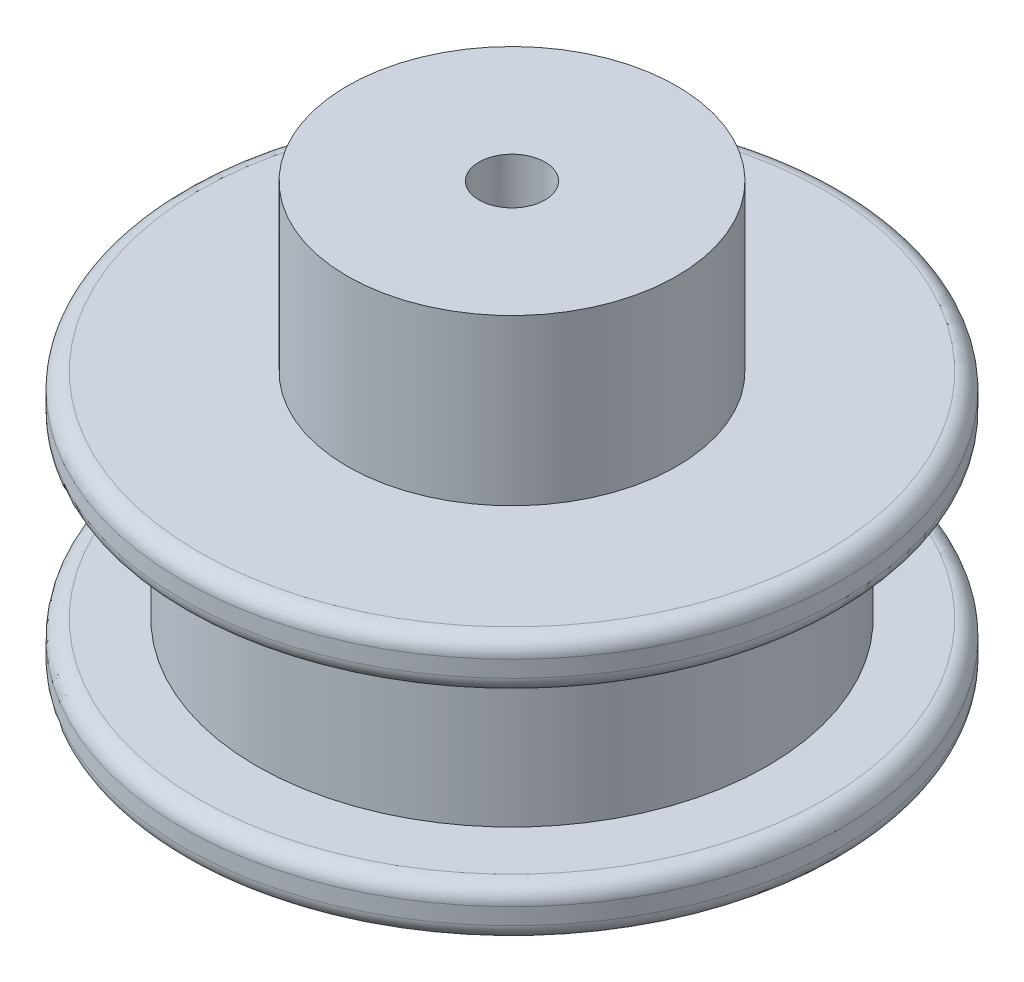
ISO-10303-21;
HEADER;
FILE_DESCRIPTION(('STEP AP214'),'2;1');
FILE_NAME('part.step','',(''),(''),'','','');
FILE_SCHEMA(('AUTOMOTIVE_DESIGN { 1 0 10303 214 1 1 1 1 }'));
ENDSEC;
DATA;
#1=APPLICATION_CONTEXT('core data for automotive mechanical design processes');
#2=APPLICATION_PROTOCOL_DEFINITION('international standard','automotive_design',2000,#1);
#3=PRODUCT_CONTEXT('',#1,'mechanical');
#4=PRODUCT('Part','Part','',(#3));
#5=PRODUCT_RELATED_PRODUCT_CATEGORY('part','',(#4));
#6=PRODUCT_DEFINITION_FORMATION('','',#4);
#7=PRODUCT_DEFINITION_CONTEXT('part definition',#1,'design');
#8=PRODUCT_DEFINITION('design','',#6,#7);
#9=PRODUCT_DEFINITION_SHAPE('','',#8);
#10=(LENGTH_UNIT() NAMED_UNIT(*) SI_UNIT(.MILLI.,.METRE.));
#11=(NAMED_UNIT(*) PLANE_ANGLE_UNIT() SI_UNIT($,.RADIAN.));
#12=(NAMED_UNIT(*) SI_UNIT($,.STERADIAN.) SOLID_ANGLE_UNIT());
#13=UNCERTAINTY_MEASURE_WITH_UNIT(LENGTH_MEASURE(1.E-05),#10,'distance_accuracy_value','');
#14=(GEOMETRIC_REPRESENTATION_CONTEXT(3) GLOBAL_UNCERTAINTY_ASSIGNED_CONTEXT((#13)) GLOBAL_UNIT_ASSIGNED_CONTEXT((#10,
#11,#12)) REPRESENTATION_CONTEXT('',''));
#15=CARTESIAN_POINT('',(0.,0.,0.));
#16=DIRECTION('',(0.,0.,1.));
#17=DIRECTION('',(1.,0.,0.));
#18=AXIS2_PLACEMENT_3D('',#15,#16,#17);
#19=CARTESIAN_POINT('',(0.,13.,0.));
#20=DIRECTION('',(0.,1.,0.));
#21=DIRECTION('',(0.,0.,1.));
#22=AXIS2_PLACEMENT_3D('',#19,#20,#21);
#23=PLANE('',#22);
#24=CARTESIAN_POINT('',(0.,13.,0.));
#25=DIRECTION('',(0.,1.,0.));
#26=DIRECTION('',(0.,0.,1.));
#27=AXIS2_PLACEMENT_3D('',#24,#25,#26);
#28=CIRCLE('',#27,19.);
#29=CARTESIAN_POINT('',(0.,13.,19.));
#30=VERTEX_POINT('',#29);
#31=EDGE_CURVE('E12',#30,#30,#28,.T.);
#32=ORIENTED_EDGE('',*,*,#31,.T.);
#33=EDGE_LOOP('',(#32));
#34=FACE_BOUND('',#33,.T.);
#35=CARTESIAN_POINT('',(0.,13.,0.));
#36=DIRECTION('',(0.,1.,0.));
#37=DIRECTION('',(0.,0.,1.));
#38=AXIS2_PLACEMENT_3D('',#35,#36,#37);
#39=CIRCLE('',#38,10.);
#40=CARTESIAN_POINT('',(0.,13.,10.));
#41=VERTEX_POINT('',#40);
#42=EDGE_CURVE('E98',#41,#41,#39,.T.);
#43=ORIENTED_EDGE('',*,*,#42,.F.);
#44=EDGE_LOOP('',(#43));
#45=FACE_BOUND('',#44,.T.);
#46=ADVANCED_FACE('F58',(#34,#45),#23,.T.);
#47=CARTESIAN_POINT('',(0.,10.,0.));
#48=DIRECTION('',(0.,-1.,0.));
#49=DIRECTION('',(0.,0.,-1.));
#50=AXIS2_PLACEMENT_3D('',#47,#48,#49);
#51=CYLINDRICAL_SURFACE('',#50,15.5);
#52=CARTESIAN_POINT('',(0.,10.,0.));
#53=DIRECTION('',(0.,1.,0.));
#54=DIRECTION('',(0.,0.,1.));
#55=AXIS2_PLACEMENT_3D('',#52,#53,#54);
#56=CIRCLE('',#55,15.5);
#57=CARTESIAN_POINT('',(0.,10.,15.5));
#58=VERTEX_POINT('',#57);
#59=EDGE_CURVE('E113',#58,#58,#56,.T.);
#60=ORIENTED_EDGE('',*,*,#59,.F.);
#61=EDGE_LOOP('',(#60));
#62=FACE_BOUND('',#61,.T.);
#63=CARTESIAN_POINT('',(0.,0.,0.));
#64=DIRECTION('',(0.,1.,0.));
#65=DIRECTION('',(0.,0.,1.));
#66=AXIS2_PLACEMENT_3D('',#63,#64,#65);
#67=CIRCLE('',#66,15.5);
#68=CARTESIAN_POINT('',(0.,0.,15.5));
#69=VERTEX_POINT('',#68);
#70=EDGE_CURVE('E112',#69,#69,#67,.T.);
#71=ORIENTED_EDGE('',*,*,#70,.T.);
#72=EDGE_LOOP('',(#71));
#73=FACE_BOUND('',#72,.T.);
#74=ADVANCED_FACE('F161',(#62,#73),#51,.T.);
#75=CARTESIAN_POINT('',(0.,13.,0.));
#76=DIRECTION('',(0.,-1.,0.));
#77=DIRECTION('',(0.,0.,-1.));
#78=AXIS2_PLACEMENT_3D('',#75,#76,#77);
#79=CYLINDRICAL_SURFACE('',#78,20.);
#80=CARTESIAN_POINT('',(0.,11.,0.));
#81=DIRECTION('',(0.,1.,0.));
#82=DIRECTION('',(0.,0.,1.));
#83=AXIS2_PLACEMENT_3D('',#80,#81,#82);
#84=CIRCLE('',#83,20.);
#85=CARTESIAN_POINT('',(0.,11.,20.));
#86=VERTEX_POINT('',#85);
#87=EDGE_CURVE('E140',#86,#86,#84,.T.);
#88=ORIENTED_EDGE('',*,*,#87,.T.);
#89=EDGE_LOOP('',(#88));
#90=FACE_BOUND('',#89,.T.);
#91=CARTESIAN_POINT('',(0.,12.,0.));
#92=DIRECTION('',(0.,1.,0.));
#93=DIRECTION('',(0.,0.,1.));
#94=AXIS2_PLACEMENT_3D('',#91,#92,#93);
#95=CIRCLE('',#94,20.);
#96=CARTESIAN_POINT('',(0.,12.,20.));
#97=VERTEX_POINT('',#96);
#98=EDGE_CURVE('E136',#97,#97,#95,.F.);
#99=ORIENTED_EDGE('',*,*,#98,.T.);
#100=EDGE_LOOP('',(#99));
#101=FACE_BOUND('',#100,.T.);
#102=ADVANCED_FACE('F158',(#90,#101),#79,.T.);
#103=CARTESIAN_POINT('',(0.,10.,0.));
#104=DIRECTION('',(0.,1.,0.));
#105=DIRECTION('',(0.,0.,1.));
#106=AXIS2_PLACEMENT_3D('',#103,#104,#105);
#107=PLANE('',#106);
#108=CARTESIAN_POINT('',(0.,10.,0.));
#109=DIRECTION('',(0.,1.,0.));
#110=DIRECTION('',(0.,0.,1.));
#111=AXIS2_PLACEMENT_3D('',#108,#109,#110);
#112=CIRCLE('',#111,19.);
#113=CARTESIAN_POINT('',(0.,10.,19.));
#114=VERTEX_POINT('',#113);
#115=EDGE_CURVE('E73',#114,#114,#112,.F.);
#116=ORIENTED_EDGE('',*,*,#115,.T.);
#117=EDGE_LOOP('',(#116));
#118=FACE_BOUND('',#117,.T.);
#119=ORIENTED_EDGE('',*,*,#59,.T.);
#120=EDGE_LOOP('',(#119));
#121=FACE_BOUND('',#120,.T.);
#122=ADVANCED_FACE('F149',(#118,#121),#107,.F.);
#123=CARTESIAN_POINT('',(0.,-3.,0.));
#124=DIRECTION('',(0.,1.,0.));
#125=DIRECTION('',(0.,0.,1.));
#126=AXIS2_PLACEMENT_3D('',#123,#124,#125);
#127=CYLINDRICAL_SURFACE('',#126,20.);
#128=CARTESIAN_POINT('',(0.,-1.,0.));
#129=DIRECTION('',(0.,-1.,0.));
#130=DIRECTION('',(0.,0.,-1.));
#131=AXIS2_PLACEMENT_3D('',#128,#129,#130);
#132=CIRCLE('',#131,20.);
#133=CARTESIAN_POINT('',(0.,-1.,-20.));
#134=VERTEX_POINT('',#133);
#135=EDGE_CURVE('E124',#134,#134,#132,.T.);
#136=ORIENTED_EDGE('',*,*,#135,.T.);
#137=EDGE_LOOP('',(#136));
#138=FACE_BOUND('',#137,.T.);
#139=CARTESIAN_POINT('',(0.,-2.,0.));
#140=DIRECTION('',(0.,-1.,0.));
#141=DIRECTION('',(0.,0.,-1.));
#142=AXIS2_PLACEMENT_3D('',#139,#140,#141);
#143=CIRCLE('',#142,20.);
#144=CARTESIAN_POINT('',(0.,-2.,-20.));
#145=VERTEX_POINT('',#144);
#146=EDGE_CURVE('E117',#145,#145,#143,.F.);
#147=ORIENTED_EDGE('',*,*,#146,.T.);
#148=EDGE_LOOP('',(#147));
#149=FACE_BOUND('',#148,.T.);
#150=ADVANCED_FACE('F195',(#138,#149),#127,.T.);
#151=CARTESIAN_POINT('',(0.,-3.,0.));
#152=DIRECTION('',(0.,-1.,0.));
#153=DIRECTION('',(0.,0.,-1.));
#154=AXIS2_PLACEMENT_3D('',#151,#152,#153);
#155=PLANE('',#154);
#156=CARTESIAN_POINT('',(0.,-3.,0.));
#157=DIRECTION('',(0.,1.,0.));
#158=DIRECTION('',(0.,0.,1.));
#159=AXIS2_PLACEMENT_3D('',#156,#157,#158);
#160=CIRCLE('',#159,2.);
#161=CARTESIAN_POINT('',(0.,-3.,2.));
#162=VERTEX_POINT('',#161);
#163=EDGE_CURVE('E105',#162,#162,#160,.T.);
#164=ORIENTED_EDGE('',*,*,#163,.T.);
#165=EDGE_LOOP('',(#164));
#166=FACE_BOUND('',#165,.T.);
#167=CARTESIAN_POINT('',(0.,-3.,0.));
#168=DIRECTION('',(0.,-1.,0.));
#169=DIRECTION('',(0.,0.,-1.));
#170=AXIS2_PLACEMENT_3D('',#167,#168,#169);
#171=CIRCLE('',#170,19.);
#172=CARTESIAN_POINT('',(0.,-3.,-19.));
#173=VERTEX_POINT('',#172);
#174=EDGE_CURVE('E132',#173,#173,#171,.T.);
#175=ORIENTED_EDGE('',*,*,#174,.T.);
#176=EDGE_LOOP('',(#175));
#177=FACE_BOUND('',#176,.T.);
#178=ADVANCED_FACE('F191',(#166,#177),#155,.T.);
#179=CARTESIAN_POINT('',(0.,0.,0.));
#180=DIRECTION('',(0.,-1.,0.));
#181=DIRECTION('',(0.,0.,-1.));
#182=AXIS2_PLACEMENT_3D('',#179,#180,#181);
#183=PLANE('',#182);
#184=CARTESIAN_POINT('',(0.,0.,0.));
#185=DIRECTION('',(0.,-1.,0.));
#186=DIRECTION('',(0.,0.,-1.));
#187=AXIS2_PLACEMENT_3D('',#184,#185,#186);
#188=CIRCLE('',#187,19.);
#189=CARTESIAN_POINT('',(0.,0.,-19.));
#190=VERTEX_POINT('',#189);
#191=EDGE_CURVE('E128',#190,#190,#188,.F.);
#192=ORIENTED_EDGE('',*,*,#191,.T.);
#193=EDGE_LOOP('',(#192));
#194=FACE_BOUND('',#193,.T.);
#195=ORIENTED_EDGE('',*,*,#70,.F.);
#196=EDGE_LOOP('',(#195));
#197=FACE_BOUND('',#196,.T.);
#198=ADVANCED_FACE('F194',(#194,#197),#183,.F.);
#199=CARTESIAN_POINT('',(0.,-1.,0.));
#200=DIRECTION('',(0.,-1.,0.));
#201=DIRECTION('',(0.,0.,-1.));
#202=AXIS2_PLACEMENT_3D('',#199,#200,#201);
#203=TOROIDAL_SURFACE('',#202,19.,1.);
#204=ORIENTED_EDGE('',*,*,#191,.F.);
#205=EDGE_LOOP('',(#204));
#206=FACE_BOUND('',#205,.T.);
#207=ORIENTED_EDGE('',*,*,#135,.F.);
#208=EDGE_LOOP('',(#207));
#209=FACE_BOUND('',#208,.T.);
#210=ADVANCED_FACE('F199',(#206,#209),#203,.T.);
#211=CARTESIAN_POINT('',(0.,-2.,0.));
#212=DIRECTION('',(0.,-1.,0.));
#213=DIRECTION('',(0.,0.,-1.));
#214=AXIS2_PLACEMENT_3D('',#211,#212,#213);
#215=TOROIDAL_SURFACE('',#214,19.,1.);
#216=ORIENTED_EDGE('',*,*,#146,.F.);
#217=EDGE_LOOP('',(#216));
#218=FACE_BOUND('',#217,.T.);
#219=ORIENTED_EDGE('',*,*,#174,.F.);
#220=EDGE_LOOP('',(#219));
#221=FACE_BOUND('',#220,.T.);
#222=ADVANCED_FACE('F155',(#218,#221),#215,.T.);
#223=CARTESIAN_POINT('',(0.,11.,0.));
#224=DIRECTION('',(0.,1.,0.));
#225=DIRECTION('',(0.,0.,1.));
#226=AXIS2_PLACEMENT_3D('',#223,#224,#225);
#227=TOROIDAL_SURFACE('',#226,19.,1.);
#228=ORIENTED_EDGE('',*,*,#115,.F.);
#229=EDGE_LOOP('',(#228));
#230=FACE_BOUND('',#229,.T.);
#231=ORIENTED_EDGE('',*,*,#87,.F.);
#232=EDGE_LOOP('',(#231));
#233=FACE_BOUND('',#232,.T.);
#234=ADVANCED_FACE('F152',(#230,#233),#227,.T.);
#235=CARTESIAN_POINT('',(0.,12.,0.));
#236=DIRECTION('',(0.,1.,0.));
#237=DIRECTION('',(0.,0.,1.));
#238=AXIS2_PLACEMENT_3D('',#235,#236,#237);
#239=TOROIDAL_SURFACE('',#238,19.,1.);
#240=ORIENTED_EDGE('',*,*,#98,.F.);
#241=EDGE_LOOP('',(#240));
#242=FACE_BOUND('',#241,.T.);
#243=ORIENTED_EDGE('',*,*,#31,.F.);
#244=EDGE_LOOP('',(#243));
#245=FACE_BOUND('',#244,.T.);
#246=ADVANCED_FACE('F60',(#242,#245),#239,.T.);
#247=CARTESIAN_POINT('',(0.,-3.,0.));
#248=DIRECTION('',(0.,1.,0.));
#249=DIRECTION('',(0.,0.,1.));
#250=AXIS2_PLACEMENT_3D('',#247,#248,#249);
#251=CYLINDRICAL_SURFACE('',#250,2.);
#252=CARTESIAN_POINT('',(0.,18.1452244433203,0.));
#253=DIRECTION('',(0.,0.707106781186547,-0.707106781186547));
#254=DIRECTION('',(0.,0.707106781186547,0.707106781186547));
#255=AXIS2_PLACEMENT_3D('',#252,#253,#254);
#256=ELLIPSE('',#255,2.82842712474619,2.);
#257=CARTESIAN_POINT('',(2.,18.1452244433203,0.));
#258=VERTEX_POINT('',#257);
#259=CARTESIAN_POINT('',(-2.,18.1452244433203,0.));
#260=VERTEX_POINT('',#259);
#261=EDGE_CURVE('E85',#258,#260,#256,.T.);
#262=ORIENTED_EDGE('',*,*,#261,.T.);
#263=CARTESIAN_POINT('',(0.,18.1452244433203,0.));
#264=DIRECTION('',(0.,0.707106781186547,0.707106781186547));
#265=DIRECTION('',(0.,0.707106781186547,-0.707106781186547));
#266=AXIS2_PLACEMENT_3D('',#263,#264,#265);
#267=ELLIPSE('',#266,2.82842712474619,2.);
#268=EDGE_CURVE('E82',#260,#258,#267,.F.);
#269=ORIENTED_EDGE('',*,*,#268,.T.);
#270=EDGE_LOOP('',(#262,#269));
#271=FACE_BOUND('',#270,.T.);
#272=ORIENTED_EDGE('',*,*,#163,.F.);
#273=EDGE_LOOP('',(#272));
#274=FACE_BOUND('',#273,.T.);
#275=CARTESIAN_POINT('',(0.,23.,0.));
#276=DIRECTION('',(0.,1.,0.));
#277=DIRECTION('',(0.,0.,1.));
#278=AXIS2_PLACEMENT_3D('',#275,#276,#277);
#279=CIRCLE('',#278,2.);
#280=CARTESIAN_POINT('',(0.,23.,2.));
#281=VERTEX_POINT('',#280);
#282=EDGE_CURVE('E93',#281,#281,#279,.T.);
#283=ORIENTED_EDGE('',*,*,#282,.T.);
#284=EDGE_LOOP('',(#283));
#285=FACE_BOUND('',#284,.T.);
#286=ADVANCED_FACE('F90',(#271,#274,#285),#251,.F.);
#287=CARTESIAN_POINT('',(0.,23.,0.));
#288=DIRECTION('',(0.,1.,0.));
#289=DIRECTION('',(0.,0.,1.));
#290=AXIS2_PLACEMENT_3D('',#287,#288,#289);
#291=PLANE('',#290);
#292=CARTESIAN_POINT('',(0.,23.,0.));
#293=DIRECTION('',(0.,1.,0.));
#294=DIRECTION('',(0.,0.,1.));
#295=AXIS2_PLACEMENT_3D('',#292,#293,#294);
#296=CIRCLE('',#295,10.);
#297=CARTESIAN_POINT('',(0.,23.,10.));
#298=VERTEX_POINT('',#297);
#299=EDGE_CURVE('E101',#298,#298,#296,.T.);
#300=ORIENTED_EDGE('',*,*,#299,.T.);
#301=EDGE_LOOP('',(#300));
#302=FACE_BOUND('',#301,.T.);
#303=ORIENTED_EDGE('',*,*,#282,.F.);
#304=EDGE_LOOP('',(#303));
#305=FACE_BOUND('',#304,.T.);
#306=ADVANCED_FACE('F176',(#302,#305),#291,.T.);
#307=CARTESIAN_POINT('',(0.,23.,0.));
#308=DIRECTION('',(0.,-1.,0.));
#309=DIRECTION('',(0.,0.,-1.));
#310=AXIS2_PLACEMENT_3D('',#307,#308,#309);
#311=CYLINDRICAL_SURFACE('',#310,10.);
#312=CARTESIAN_POINT('',(0.,20.1452244433203,-10.));
#313=CARTESIAN_POINT('',(-0.111153813585266,20.1452203543236,-9.99999795161742));
#314=CARTESIAN_POINT('',(-0.222359320403045,20.135926757385,-9.99812770356462));
#315=CARTESIAN_POINT('',(-0.441627015378039,20.0990274430898,-9.99084731246463));
#316=CARTESIAN_POINT('',(-0.549686635082712,20.0714071777172,-9.98543435720372));
#317=CARTESIAN_POINT('',(-0.759460610526626,19.9987418960787,-9.97167298556573));
#318=CARTESIAN_POINT('',(-0.861180935866269,19.9537135696309,-9.96332738153436));
#319=CARTESIAN_POINT('',(-1.05561597772845,19.8475599482977,-9.94460796070629));
#320=CARTESIAN_POINT('',(-1.14833123015162,19.7864356121058,-9.93423426471414));
#321=CARTESIAN_POINT('',(-1.32338695462973,19.6489474547374,-9.9124433065994));
#322=CARTESIAN_POINT('',(-1.40558790231705,19.5724077325379,-9.90101491008695));
#323=CARTESIAN_POINT('',(-1.55607351321606,19.4066396105369,-9.87848360905177));
#324=CARTESIAN_POINT('',(-1.62435708954085,19.31741022065,-9.86738073000847));
#325=CARTESIAN_POINT('',(-1.74566350669524,19.1277920572965,-9.8466488362523));
#326=CARTESIAN_POINT('',(-1.79854187773173,19.0273091557275,-9.83703414729892));
#327=CARTESIAN_POINT('',(-1.88661133316062,18.8186608053121,-9.82052536116836));
#328=CARTESIAN_POINT('',(-1.92180416487448,18.7104961166276,-9.81363099523923));
#329=CARTESIAN_POINT('',(-1.97305059976965,18.4910557155044,-9.80345610504409));
#330=CARTESIAN_POINT('',(-1.98934899591755,18.3798393550358,-9.80012940214375));
#331=CARTESIAN_POINT('',(-2.00310425545224,18.1562048005916,-9.79732750121254));
#332=CARTESIAN_POINT('',(-2.000563045427,18.04378673068,-9.79785190935681));
#333=CARTESIAN_POINT('',(-1.97690914620364,17.8227308672782,-9.80265102296369));
#334=CARTESIAN_POINT('',(-1.95607708048781,17.7140616320656,-9.80686905717527));
#335=CARTESIAN_POINT('',(-1.8968757692461,17.5017922899943,-9.81849092320002));
#336=CARTESIAN_POINT('',(-1.85850568620136,17.3981924254822,-9.82589490715558));
#337=CARTESIAN_POINT('',(-1.76504956734944,17.1981939199131,-9.84311237000816));
#338=CARTESIAN_POINT('',(-1.70985230246423,17.1018486841819,-9.85294179627409));
#339=CARTESIAN_POINT('',(-1.58438714914536,16.9196827433746,-9.87389237546124));
#340=CARTESIAN_POINT('',(-1.51411752871366,16.8338632496179,-9.88501367676732));
#341=CARTESIAN_POINT('',(-1.35899986912117,16.6735656384064,-9.90754042482924));
#342=CARTESIAN_POINT('',(-1.27391232242489,16.599319307602,-9.9189473842181));
#343=CARTESIAN_POINT('',(-1.09237004812402,16.4661167507178,-9.94057697428817));
#344=CARTESIAN_POINT('',(-0.995915174758779,16.4071607207331,-9.95079958977947));
#345=CARTESIAN_POINT('',(-0.794118773757842,16.3061694248683,-9.96893380321774));
#346=CARTESIAN_POINT('',(-0.688763639170601,16.2641606560312,-9.97684177696544));
#347=CARTESIAN_POINT('',(-0.472297952897331,16.1985034952431,-9.98942817975717));
#348=CARTESIAN_POINT('',(-0.3611881001449,16.174852879173,-9.99410700001063));
#349=CARTESIAN_POINT('',(-0.138358811254301,16.1469115357317,-9.99965343733735));
#350=CARTESIAN_POINT('',(-0.0266806566511518,16.1423036042397,-10.0005834930494));
#351=CARTESIAN_POINT('',(0.195849868385429,16.1517241612046,-9.99870103860205));
#352=CARTESIAN_POINT('',(0.306702284887588,16.1657516020254,-9.99588873882892));
#353=CARTESIAN_POINT('',(0.523411319893084,16.2117811904082,-9.98687664016035));
#354=CARTESIAN_POINT('',(0.629303896679809,16.2436205803161,-9.98070752808413));
#355=CARTESIAN_POINT('',(0.834247254999337,16.3241924086319,-9.96567104122065));
#356=CARTESIAN_POINT('',(0.933297523275081,16.3729261126739,-9.95680346428453));
#357=CARTESIAN_POINT('',(1.12308234737244,16.4865894246229,-9.93719823066589));
#358=CARTESIAN_POINT('',(1.21370025350438,16.5517100053981,-9.92643900874103));
#359=CARTESIAN_POINT('',(1.38283603823841,16.6960428257348,-9.90429469659765));
#360=CARTESIAN_POINT('',(1.46135261786153,16.77525657612,-9.89290953936776));
#361=CARTESIAN_POINT('',(1.60528118154835,16.9469711471025,-9.8705860711393));
#362=CARTESIAN_POINT('',(1.67047540489731,17.0396559317629,-9.85965720466608));
#363=CARTESIAN_POINT('',(1.78437084010241,17.2348471660336,-9.83968383592388));
#364=CARTESIAN_POINT('',(1.83307271184581,17.3373532224674,-9.83063925826685));
#365=CARTESIAN_POINT('',(1.91230368316392,17.5487609356194,-9.81553481168766));
#366=CARTESIAN_POINT('',(1.9429269995821,17.6576261257409,-9.80945949744373));
#367=CARTESIAN_POINT('',(1.98541730325439,17.8790913503021,-9.8009487358405));
#368=CARTESIAN_POINT('',(1.99728673645023,17.9916908957389,-9.79851281382223));
#369=CARTESIAN_POINT('',(2.00184182173494,18.2152421724089,-9.79758299262758));
#370=CARTESIAN_POINT('',(1.99487157614179,18.3261867411743,-9.79901838378602));
#371=CARTESIAN_POINT('',(1.96270460820012,18.5452877431303,-9.80551146969228));
#372=CARTESIAN_POINT('',(1.9375080322586,18.6534441987099,-9.81056913534338));
#373=CARTESIAN_POINT('',(1.86975713699791,18.8636798658014,-9.82370528438317));
#374=CARTESIAN_POINT('',(1.82724501343469,18.9657731643251,-9.83177642037661));
#375=CARTESIAN_POINT('',(1.72610928920321,19.1614318847891,-9.85003429948341));
#376=CARTESIAN_POINT('',(1.66748433754976,19.2549965907705,-9.86022121997788));
#377=CARTESIAN_POINT('',(1.53461182957283,19.4326555876209,-9.88177921046451));
#378=CARTESIAN_POINT('',(1.46011577447036,19.5165619738554,-9.89316745819399));
#379=CARTESIAN_POINT('',(1.29812873802628,19.6707968543786,-9.91572163743909));
#380=CARTESIAN_POINT('',(1.21063477430667,19.7411222239548,-9.92688751726369));
#381=CARTESIAN_POINT('',(1.02403525817649,19.8668937312132,-9.94787664775943));
#382=CARTESIAN_POINT('',(0.924817768859669,19.9221764498803,-9.95768462438492));
#383=CARTESIAN_POINT('',(0.718332721881464,20.0151966885134,-9.9747025017));
#384=CARTESIAN_POINT('',(0.61107252172625,20.0529500223852,-9.98191474277232));
#385=CARTESIAN_POINT('',(0.419642977847557,20.1025283394097,-9.99152745190741));
#386=CARTESIAN_POINT('',(0.336563328027567,20.1185108307358,-9.99468606316904));
#387=CARTESIAN_POINT('',(0.168999050420133,20.139860268037,-9.99892308279786));
#388=CARTESIAN_POINT('',(0.0845144674972376,20.1452275523398,-10.0000015574631));
#389=CARTESIAN_POINT('',(0.,20.1452244433203,-10.));
#390=B_SPLINE_CURVE_WITH_KNOTS('',3,(#312,#313,#314,#315,#316,#317,#318,#319,#320,#321,#322,
#323,#324,#325,#326,#327,#328,#329,#330,#331,#332,#333,#334,#335,#336,#337,#338,#339,#340,#341,
#342,#343,#344,#345,#346,#347,#348,#349,#350,#351,#352,#353,#354,#355,#356,#357,#358,#359,#360,
#361,#362,#363,#364,#365,#366,#367,#368,#369,#370,#371,#372,#373,#374,#375,#376,#377,#378,#379,
#380,#381,#382,#383,#384,#385,#386,#387,#388,#389),.UNSPECIFIED.,.T.,.F.,(4,2,2,2,2,2,2,2,2,2,2,
2,2,2,2,2,2,2,2,2,2,2,2,2,2,2,2,2,2,2,2,2,2,2,2,2,2,2,4),(0.,0.333152261322517,
0.666569301382646,0.999667470500685,1.33274580446173,1.66986534022437,2.00701119349473,
2.34722390011845,2.68740298730395,3.02312370207175,3.3588100856245,3.68943454012557,
4.02007478507459,4.35294980407185,4.68586309499341,5.02476504982701,5.3636713507964,
5.70310549708048,6.04249851396072,6.3762147135253,6.70991215315735,7.04060907901447,
7.37133078432045,7.70610132066717,8.0409077669186,8.38081257158452,8.72070377446933,
9.05880762065446,9.39686736660829,9.72879445135403,10.0607188698522,10.3918392250622,
10.7229873516373,11.0597615247829,11.3966130906586,11.7369899335127,12.0770591103504,
12.3303755057979,12.5836838274199),.UNSPECIFIED.);
#391=CARTESIAN_POINT('',(0.,20.1452244433203,-10.));
#392=VERTEX_POINT('',#391);
#393=EDGE_CURVE('E62',#392,#392,#390,.T.);
#394=ORIENTED_EDGE('',*,*,#393,.T.);
#395=EDGE_LOOP('',(#394));
#396=FACE_BOUND('',#395,.T.);
#397=ORIENTED_EDGE('',*,*,#299,.F.);
#398=EDGE_LOOP('',(#397));
#399=FACE_BOUND('',#398,.T.);
#400=ORIENTED_EDGE('',*,*,#42,.T.);
#401=EDGE_LOOP('',(#400));
#402=FACE_BOUND('',#401,.T.);
#403=ADVANCED_FACE('F174',(#396,#399,#402),#311,.T.);
#404=CARTESIAN_POINT('',(0.,18.1452244433203,-20.));
#405=DIRECTION('',(0.,0.,1.));
#406=DIRECTION('',(1.,0.,0.));
#407=AXIS2_PLACEMENT_3D('',#404,#405,#406);
#408=CYLINDRICAL_SURFACE('',#407,2.);
#409=ORIENTED_EDGE('',*,*,#393,.F.);
#410=EDGE_LOOP('',(#409));
#411=FACE_BOUND('',#410,.T.);
#412=ORIENTED_EDGE('',*,*,#261,.F.);
#413=ORIENTED_EDGE('',*,*,#268,.F.);
#414=EDGE_LOOP('',(#412,#413));
#415=FACE_BOUND('',#414,.T.);
#416=ADVANCED_FACE('F86',(#411,#415),#408,.F.);
#417=CLOSED_SHELL('',(#46,#74,#102,#122,#150,#178,#198,#210,#222,#234,#246,#286,#306,#403,#416));
#418=MANIFOLD_SOLID_BREP('B2',#417);
#419=ADVANCED_BREP_SHAPE_REPRESENTATION('',(#18,#418),#14);
#420=SHAPE_DEFINITION_REPRESENTATION(#9,#419);
ENDSEC;
END-ISO-10303-21;
